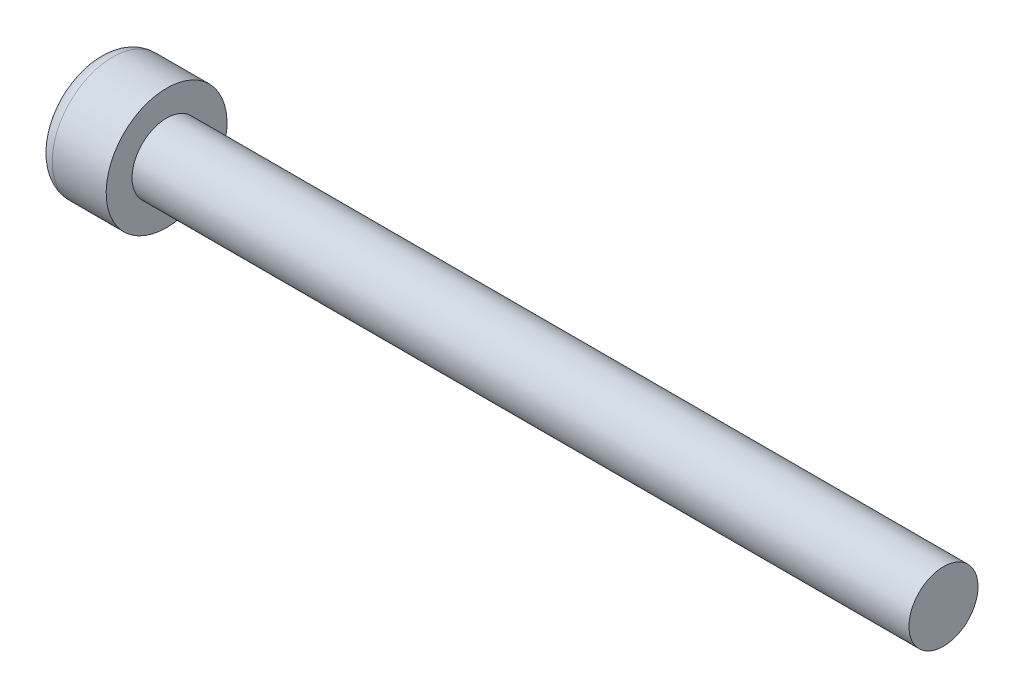
ISO-10303-21;
HEADER;
FILE_DESCRIPTION(('STEP AP214'),'2;1');
FILE_NAME('part.step','',(''),(''),'','','');
FILE_SCHEMA(('AUTOMOTIVE_DESIGN { 1 0 10303 214 1 1 1 1 }'));
ENDSEC;
DATA;
#1=APPLICATION_CONTEXT('core data for automotive mechanical design processes');
#2=APPLICATION_PROTOCOL_DEFINITION('international standard','automotive_design',2000,#1);
#3=PRODUCT_CONTEXT('',#1,'mechanical');
#4=PRODUCT('Part','Part','',(#3));
#5=PRODUCT_RELATED_PRODUCT_CATEGORY('part','',(#4));
#6=PRODUCT_DEFINITION_FORMATION('','',#4);
#7=PRODUCT_DEFINITION_CONTEXT('part definition',#1,'design');
#8=PRODUCT_DEFINITION('design','',#6,#7);
#9=PRODUCT_DEFINITION_SHAPE('','',#8);
#10=(LENGTH_UNIT() NAMED_UNIT(*) SI_UNIT(.MILLI.,.METRE.));
#11=(NAMED_UNIT(*) PLANE_ANGLE_UNIT() SI_UNIT($,.RADIAN.));
#12=(NAMED_UNIT(*) SI_UNIT($,.STERADIAN.) SOLID_ANGLE_UNIT());
#13=UNCERTAINTY_MEASURE_WITH_UNIT(LENGTH_MEASURE(1.E-05),#10,'distance_accuracy_value','');
#14=(GEOMETRIC_REPRESENTATION_CONTEXT(3) GLOBAL_UNCERTAINTY_ASSIGNED_CONTEXT((#13)) GLOBAL_UNIT_ASSIGNED_CONTEXT((#10,
#11,#12)) REPRESENTATION_CONTEXT('',''));
#15=CARTESIAN_POINT('',(0.,0.,0.));
#16=DIRECTION('',(0.,0.,1.));
#17=DIRECTION('',(1.,0.,0.));
#18=AXIS2_PLACEMENT_3D('',#15,#16,#17);
#19=CARTESIAN_POINT('',(0.,0.,0.));
#20=DIRECTION('',(1.,0.,0.));
#21=DIRECTION('',(0.,1.,0.));
#22=AXIS2_PLACEMENT_3D('',#19,#20,#21);
#23=PLANE('',#22);
#24=DIRECTION('',(0.,-0.5,-0.866025403784439));
#25=VECTOR('',#24,1.);
#26=CARTESIAN_POINT('',(0.,1.73205080756888,0.));
#27=LINE('',#26,#25);
#28=CARTESIAN_POINT('',(0.,1.73205080756888,0.));
#29=VERTEX_POINT('',#28);
#30=CARTESIAN_POINT('',(0.,0.866025403784439,-1.5));
#31=VERTEX_POINT('',#30);
#32=EDGE_CURVE('E121',#29,#31,#27,.T.);
#33=ORIENTED_EDGE('',*,*,#32,.F.);
#34=DIRECTION('',(0.,0.5,-0.866025403784439));
#35=VECTOR('',#34,1.);
#36=CARTESIAN_POINT('',(0.,0.866025403784439,1.5));
#37=LINE('',#36,#35);
#38=CARTESIAN_POINT('',(0.,0.866025403784439,1.5));
#39=VERTEX_POINT('',#38);
#40=EDGE_CURVE('E47',#39,#29,#37,.T.);
#41=ORIENTED_EDGE('',*,*,#40,.F.);
#42=DIRECTION('',(0.,1.,0.));
#43=VECTOR('',#42,1.);
#44=CARTESIAN_POINT('',(0.,-0.866025403784439,1.5));
#45=LINE('',#44,#43);
#46=CARTESIAN_POINT('',(0.,-0.866025403784439,1.5));
#47=VERTEX_POINT('',#46);
#48=EDGE_CURVE('E130',#47,#39,#45,.T.);
#49=ORIENTED_EDGE('',*,*,#48,.F.);
#50=DIRECTION('',(0.,0.5,0.866025403784439));
#51=VECTOR('',#50,1.);
#52=CARTESIAN_POINT('',(0.,-1.73205080756888,0.));
#53=LINE('',#52,#51);
#54=CARTESIAN_POINT('',(0.,-1.73205080756888,0.));
#55=VERTEX_POINT('',#54);
#56=EDGE_CURVE('E128',#55,#47,#53,.T.);
#57=ORIENTED_EDGE('',*,*,#56,.F.);
#58=DIRECTION('',(0.,-0.5,0.866025403784439));
#59=VECTOR('',#58,1.);
#60=CARTESIAN_POINT('',(0.,-0.866025403784439,-1.5));
#61=LINE('',#60,#59);
#62=CARTESIAN_POINT('',(0.,-0.866025403784439,-1.5));
#63=VERTEX_POINT('',#62);
#64=EDGE_CURVE('E95',#63,#55,#61,.T.);
#65=ORIENTED_EDGE('',*,*,#64,.F.);
#66=DIRECTION('',(0.,-1.,0.));
#67=VECTOR('',#66,1.);
#68=CARTESIAN_POINT('',(0.,0.866025403784439,-1.5));
#69=LINE('',#68,#67);
#70=EDGE_CURVE('E124',#31,#63,#69,.T.);
#71=ORIENTED_EDGE('',*,*,#70,.F.);
#72=EDGE_LOOP('',(#33,#41,#49,#57,#65,#71));
#73=FACE_BOUND('',#72,.T.);
#74=CARTESIAN_POINT('',(0.,0.,0.));
#75=DIRECTION('',(-1.,0.,0.));
#76=DIRECTION('',(0.,-1.,0.));
#77=AXIS2_PLACEMENT_3D('',#74,#75,#76);
#78=CIRCLE('',#77,2.625);
#79=CARTESIAN_POINT('',(0.,-2.625,0.));
#80=VERTEX_POINT('',#79);
#81=EDGE_CURVE('E11',#80,#80,#78,.T.);
#82=ORIENTED_EDGE('',*,*,#81,.T.);
#83=EDGE_LOOP('',(#82));
#84=FACE_BOUND('',#83,.T.);
#85=ADVANCED_FACE('F33',(#73,#84),#23,.F.);
#86=CARTESIAN_POINT('',(0.875,0.,0.));
#87=DIRECTION('',(-1.,0.,0.));
#88=DIRECTION('',(0.,-1.,0.));
#89=AXIS2_PLACEMENT_3D('',#86,#87,#88);
#90=TOROIDAL_SURFACE('',#89,2.625,0.875);
#91=ORIENTED_EDGE('',*,*,#81,.F.);
#92=EDGE_LOOP('',(#91));
#93=FACE_BOUND('',#92,.T.);
#94=CARTESIAN_POINT('',(0.875,0.,0.));
#95=DIRECTION('',(-1.,0.,0.));
#96=DIRECTION('',(0.,-1.,0.));
#97=AXIS2_PLACEMENT_3D('',#94,#95,#96);
#98=CIRCLE('',#97,3.5);
#99=CARTESIAN_POINT('',(0.875000000000001,-3.5,0.));
#100=VERTEX_POINT('',#99);
#101=EDGE_CURVE('E40',#100,#100,#98,.T.);
#102=ORIENTED_EDGE('',*,*,#101,.T.);
#103=EDGE_LOOP('',(#102));
#104=FACE_BOUND('',#103,.T.);
#105=ADVANCED_FACE('F150',(#93,#104),#90,.T.);
#106=CARTESIAN_POINT('',(0.,0.,0.));
#107=DIRECTION('',(-1.,0.,0.));
#108=DIRECTION('',(0.,-1.,0.));
#109=AXIS2_PLACEMENT_3D('',#106,#107,#108);
#110=CYLINDRICAL_SURFACE('',#109,3.5);
#111=ORIENTED_EDGE('',*,*,#101,.F.);
#112=EDGE_LOOP('',(#111));
#113=FACE_BOUND('',#112,.T.);
#114=CARTESIAN_POINT('',(4.,0.,0.));
#115=DIRECTION('',(-1.,0.,0.));
#116=DIRECTION('',(0.,-1.,0.));
#117=AXIS2_PLACEMENT_3D('',#114,#115,#116);
#118=CIRCLE('',#117,3.5);
#119=CARTESIAN_POINT('',(4.,-3.5,0.));
#120=VERTEX_POINT('',#119);
#121=EDGE_CURVE('E145',#120,#120,#118,.T.);
#122=ORIENTED_EDGE('',*,*,#121,.T.);
#123=EDGE_LOOP('',(#122));
#124=FACE_BOUND('',#123,.T.);
#125=ADVANCED_FACE('F152',(#113,#124),#110,.T.);
#126=CARTESIAN_POINT('',(4.,3.5,0.));
#127=DIRECTION('',(-1.,0.,0.));
#128=DIRECTION('',(0.,-1.,0.));
#129=AXIS2_PLACEMENT_3D('',#126,#127,#128);
#130=PLANE('',#129);
#131=ORIENTED_EDGE('',*,*,#121,.F.);
#132=EDGE_LOOP('',(#131));
#133=FACE_BOUND('',#132,.T.);
#134=CARTESIAN_POINT('',(4.,0.,0.));
#135=DIRECTION('',(-1.,0.,0.));
#136=DIRECTION('',(0.,-1.,0.));
#137=AXIS2_PLACEMENT_3D('',#134,#135,#136);
#138=CIRCLE('',#137,2.);
#139=CARTESIAN_POINT('',(4.,-2.,0.));
#140=VERTEX_POINT('',#139);
#141=EDGE_CURVE('E142',#140,#140,#138,.T.);
#142=ORIENTED_EDGE('',*,*,#141,.T.);
#143=EDGE_LOOP('',(#142));
#144=FACE_BOUND('',#143,.T.);
#145=ADVANCED_FACE('F155',(#133,#144),#130,.F.);
#146=CARTESIAN_POINT('',(0.,0.,0.));
#147=DIRECTION('',(-1.,0.,0.));
#148=DIRECTION('',(0.,-1.,0.));
#149=AXIS2_PLACEMENT_3D('',#146,#147,#148);
#150=CYLINDRICAL_SURFACE('',#149,1.99999999999999);
#151=ORIENTED_EDGE('',*,*,#141,.F.);
#152=EDGE_LOOP('',(#151));
#153=FACE_BOUND('',#152,.T.);
#154=CARTESIAN_POINT('',(49.,0.,0.));
#155=DIRECTION('',(-1.,0.,0.));
#156=DIRECTION('',(0.,-1.,0.));
#157=AXIS2_PLACEMENT_3D('',#154,#155,#156);
#158=CIRCLE('',#157,1.99999999999999);
#159=CARTESIAN_POINT('',(49.,-1.99999999999998,0.));
#160=VERTEX_POINT('',#159);
#161=EDGE_CURVE('E134',#160,#160,#158,.T.);
#162=ORIENTED_EDGE('',*,*,#161,.T.);
#163=EDGE_LOOP('',(#162));
#164=FACE_BOUND('',#163,.T.);
#165=ADVANCED_FACE('F161',(#153,#164),#150,.T.);
#166=CARTESIAN_POINT('',(49.,2.,0.));
#167=DIRECTION('',(-1.,0.,0.));
#168=DIRECTION('',(0.,-1.,0.));
#169=AXIS2_PLACEMENT_3D('',#166,#167,#168);
#170=PLANE('',#169);
#171=ORIENTED_EDGE('',*,*,#161,.F.);
#172=EDGE_LOOP('',(#171));
#173=FACE_BOUND('',#172,.T.);
#174=ADVANCED_FACE('F167',(#173),#170,.F.);
#175=CARTESIAN_POINT('',(2.,0.866025403784439,1.5));
#176=DIRECTION('',(0.,0.866025403784439,0.5));
#177=DIRECTION('',(0.,-0.5,0.866025403784439));
#178=AXIS2_PLACEMENT_3D('',#175,#176,#177);
#179=PLANE('',#178);
#180=ORIENTED_EDGE('',*,*,#40,.T.);
#181=DIRECTION('',(-1.,0.,0.));
#182=VECTOR('',#181,1.);
#183=CARTESIAN_POINT('',(2.,1.73205080756888,0.));
#184=LINE('',#183,#182);
#185=CARTESIAN_POINT('',(2.,1.73205080756888,0.));
#186=VERTEX_POINT('',#185);
#187=EDGE_CURVE('E77',#186,#29,#184,.T.);
#188=ORIENTED_EDGE('',*,*,#187,.F.);
#189=DIRECTION('',(0.,0.5,-0.866025403784439));
#190=VECTOR('',#189,1.);
#191=CARTESIAN_POINT('',(2.,0.866025403784439,1.5));
#192=LINE('',#191,#190);
#193=CARTESIAN_POINT('',(2.,0.866025403784439,1.5));
#194=VERTEX_POINT('',#193);
#195=EDGE_CURVE('E132',#194,#186,#192,.T.);
#196=ORIENTED_EDGE('',*,*,#195,.F.);
#197=DIRECTION('',(-1.,0.,0.));
#198=VECTOR('',#197,1.);
#199=CARTESIAN_POINT('',(2.,0.866025403784439,1.5));
#200=LINE('',#199,#198);
#201=EDGE_CURVE('E55',#194,#39,#200,.T.);
#202=ORIENTED_EDGE('',*,*,#201,.T.);
#203=EDGE_LOOP('',(#180,#188,#196,#202));
#204=FACE_BOUND('',#203,.T.);
#205=ADVANCED_FACE('F172',(#204),#179,.F.);
#206=CARTESIAN_POINT('',(2.,-0.866025403784439,1.5));
#207=DIRECTION('',(0.,0.,1.));
#208=DIRECTION('',(0.,-1.,0.));
#209=AXIS2_PLACEMENT_3D('',#206,#207,#208);
#210=PLANE('',#209);
#211=ORIENTED_EDGE('',*,*,#48,.T.);
#212=ORIENTED_EDGE('',*,*,#201,.F.);
#213=DIRECTION('',(0.,1.,0.));
#214=VECTOR('',#213,1.);
#215=CARTESIAN_POINT('',(2.,-0.866025403784439,1.5));
#216=LINE('',#215,#214);
#217=CARTESIAN_POINT('',(2.,-0.866025403784439,1.5));
#218=VERTEX_POINT('',#217);
#219=EDGE_CURVE('E107',#218,#194,#216,.T.);
#220=ORIENTED_EDGE('',*,*,#219,.F.);
#221=DIRECTION('',(-1.,0.,0.));
#222=VECTOR('',#221,1.);
#223=CARTESIAN_POINT('',(2.,-0.866025403784439,1.5));
#224=LINE('',#223,#222);
#225=EDGE_CURVE('E99',#218,#47,#224,.T.);
#226=ORIENTED_EDGE('',*,*,#225,.T.);
#227=EDGE_LOOP('',(#211,#212,#220,#226));
#228=FACE_BOUND('',#227,.T.);
#229=ADVANCED_FACE('F177',(#228),#210,.F.);
#230=CARTESIAN_POINT('',(2.,-1.73205080756888,0.));
#231=DIRECTION('',(0.,-0.866025403784439,0.5));
#232=DIRECTION('',(0.,-0.5,-0.866025403784439));
#233=AXIS2_PLACEMENT_3D('',#230,#231,#232);
#234=PLANE('',#233);
#235=ORIENTED_EDGE('',*,*,#56,.T.);
#236=ORIENTED_EDGE('',*,*,#225,.F.);
#237=DIRECTION('',(0.,0.5,0.866025403784439));
#238=VECTOR('',#237,1.);
#239=CARTESIAN_POINT('',(2.,-1.73205080756888,0.));
#240=LINE('',#239,#238);
#241=CARTESIAN_POINT('',(2.,-1.73205080756888,0.));
#242=VERTEX_POINT('',#241);
#243=EDGE_CURVE('E103',#242,#218,#240,.T.);
#244=ORIENTED_EDGE('',*,*,#243,.F.);
#245=DIRECTION('',(-1.,0.,0.));
#246=VECTOR('',#245,1.);
#247=CARTESIAN_POINT('',(2.,-1.73205080756888,0.));
#248=LINE('',#247,#246);
#249=EDGE_CURVE('E88',#242,#55,#248,.T.);
#250=ORIENTED_EDGE('',*,*,#249,.T.);
#251=EDGE_LOOP('',(#235,#236,#244,#250));
#252=FACE_BOUND('',#251,.T.);
#253=ADVANCED_FACE('F104',(#252),#234,.F.);
#254=CARTESIAN_POINT('',(2.,-0.866025403784439,-1.5));
#255=DIRECTION('',(0.,-0.866025403784439,-0.5));
#256=DIRECTION('',(0.,0.5,-0.866025403784439));
#257=AXIS2_PLACEMENT_3D('',#254,#255,#256);
#258=PLANE('',#257);
#259=ORIENTED_EDGE('',*,*,#64,.T.);
#260=ORIENTED_EDGE('',*,*,#249,.F.);
#261=DIRECTION('',(0.,-0.5,0.866025403784439));
#262=VECTOR('',#261,1.);
#263=CARTESIAN_POINT('',(2.,-0.866025403784439,-1.5));
#264=LINE('',#263,#262);
#265=CARTESIAN_POINT('',(2.,-0.866025403784439,-1.5));
#266=VERTEX_POINT('',#265);
#267=EDGE_CURVE('E92',#266,#242,#264,.T.);
#268=ORIENTED_EDGE('',*,*,#267,.F.);
#269=DIRECTION('',(-1.,0.,0.));
#270=VECTOR('',#269,1.);
#271=CARTESIAN_POINT('',(2.,-0.866025403784439,-1.5));
#272=LINE('',#271,#270);
#273=EDGE_CURVE('E100',#266,#63,#272,.T.);
#274=ORIENTED_EDGE('',*,*,#273,.T.);
#275=EDGE_LOOP('',(#259,#260,#268,#274));
#276=FACE_BOUND('',#275,.T.);
#277=ADVANCED_FACE('F90',(#276),#258,.F.);
#278=CARTESIAN_POINT('',(2.,0.866025403784439,-1.5));
#279=DIRECTION('',(0.,0.,-1.));
#280=DIRECTION('',(-1.,0.,0.));
#281=AXIS2_PLACEMENT_3D('',#278,#279,#280);
#282=PLANE('',#281);
#283=ORIENTED_EDGE('',*,*,#70,.T.);
#284=ORIENTED_EDGE('',*,*,#273,.F.);
#285=DIRECTION('',(0.,-1.,0.));
#286=VECTOR('',#285,1.);
#287=CARTESIAN_POINT('',(2.,0.866025403784439,-1.5));
#288=LINE('',#287,#286);
#289=CARTESIAN_POINT('',(2.,0.866025403784439,-1.5));
#290=VERTEX_POINT('',#289);
#291=EDGE_CURVE('E113',#290,#266,#288,.T.);
#292=ORIENTED_EDGE('',*,*,#291,.F.);
#293=DIRECTION('',(-1.,0.,0.));
#294=VECTOR('',#293,1.);
#295=CARTESIAN_POINT('',(2.,0.866025403784439,-1.5));
#296=LINE('',#295,#294);
#297=EDGE_CURVE('E137',#290,#31,#296,.T.);
#298=ORIENTED_EDGE('',*,*,#297,.T.);
#299=EDGE_LOOP('',(#283,#284,#292,#298));
#300=FACE_BOUND('',#299,.T.);
#301=ADVANCED_FACE('F203',(#300),#282,.F.);
#302=CARTESIAN_POINT('',(2.,1.73205080756888,0.));
#303=DIRECTION('',(0.,0.866025403784439,-0.5));
#304=DIRECTION('',(0.,0.5,0.866025403784439));
#305=AXIS2_PLACEMENT_3D('',#302,#303,#304);
#306=PLANE('',#305);
#307=ORIENTED_EDGE('',*,*,#32,.T.);
#308=ORIENTED_EDGE('',*,*,#297,.F.);
#309=DIRECTION('',(0.,-0.5,-0.866025403784439));
#310=VECTOR('',#309,1.);
#311=CARTESIAN_POINT('',(2.,1.73205080756888,0.));
#312=LINE('',#311,#310);
#313=EDGE_CURVE('E115',#186,#290,#312,.T.);
#314=ORIENTED_EDGE('',*,*,#313,.F.);
#315=ORIENTED_EDGE('',*,*,#187,.T.);
#316=EDGE_LOOP('',(#307,#308,#314,#315));
#317=FACE_BOUND('',#316,.T.);
#318=ADVANCED_FACE('F191',(#317),#306,.F.);
#319=CARTESIAN_POINT('',(2.,0.,0.));
#320=DIRECTION('',(-1.,0.,0.));
#321=DIRECTION('',(0.,-1.,0.));
#322=AXIS2_PLACEMENT_3D('',#319,#320,#321);
#323=PLANE('',#322);
#324=ORIENTED_EDGE('',*,*,#195,.T.);
#325=ORIENTED_EDGE('',*,*,#313,.T.);
#326=ORIENTED_EDGE('',*,*,#291,.T.);
#327=ORIENTED_EDGE('',*,*,#267,.T.);
#328=ORIENTED_EDGE('',*,*,#243,.T.);
#329=ORIENTED_EDGE('',*,*,#219,.T.);
#330=EDGE_LOOP('',(#324,#325,#326,#327,#328,#329));
#331=FACE_BOUND('',#330,.T.);
#332=ADVANCED_FACE('F110',(#331),#323,.T.);
#333=CLOSED_SHELL('',(#85,#105,#125,#145,#165,#174,#205,#229,#253,#277,#301,#318,#332));
#334=MANIFOLD_SOLID_BREP('B2',#333);
#335=ADVANCED_BREP_SHAPE_REPRESENTATION('',(#18,#334),#14);
#336=SHAPE_DEFINITION_REPRESENTATION(#9,#335);
ENDSEC;
END-ISO-10303-21;
